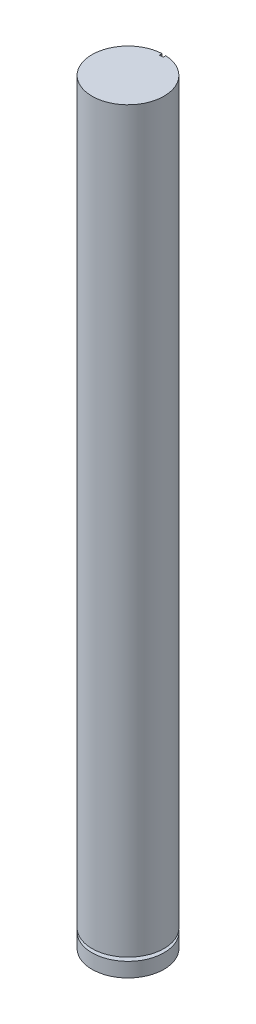
ISO-10303-21;
HEADER;
FILE_DESCRIPTION(('STEP AP214'),'2;1');
FILE_NAME('part.step','',(''),(''),'','','');
FILE_SCHEMA(('AUTOMOTIVE_DESIGN { 1 0 10303 214 1 1 1 1 }'));
ENDSEC;
DATA;
#1=APPLICATION_CONTEXT('core data for automotive mechanical design processes');
#2=APPLICATION_PROTOCOL_DEFINITION('international standard','automotive_design',2000,#1);
#3=PRODUCT_CONTEXT('',#1,'mechanical');
#4=PRODUCT('Part','Part','',(#3));
#5=PRODUCT_RELATED_PRODUCT_CATEGORY('part','',(#4));
#6=PRODUCT_DEFINITION_FORMATION('','',#4);
#7=PRODUCT_DEFINITION_CONTEXT('part definition',#1,'design');
#8=PRODUCT_DEFINITION('design','',#6,#7);
#9=PRODUCT_DEFINITION_SHAPE('','',#8);
#10=(LENGTH_UNIT() NAMED_UNIT(*) SI_UNIT(.MILLI.,.METRE.));
#11=(NAMED_UNIT(*) PLANE_ANGLE_UNIT() SI_UNIT($,.RADIAN.));
#12=(NAMED_UNIT(*) SI_UNIT($,.STERADIAN.) SOLID_ANGLE_UNIT());
#13=UNCERTAINTY_MEASURE_WITH_UNIT(LENGTH_MEASURE(1.E-05),#10,'distance_accuracy_value','');
#14=(GEOMETRIC_REPRESENTATION_CONTEXT(3) GLOBAL_UNCERTAINTY_ASSIGNED_CONTEXT((#13)) GLOBAL_UNIT_ASSIGNED_CONTEXT((#10,
#11,#12)) REPRESENTATION_CONTEXT('',''));
#15=CARTESIAN_POINT('',(0.,0.,0.));
#16=DIRECTION('',(0.,0.,1.));
#17=DIRECTION('',(1.,0.,0.));
#18=AXIS2_PLACEMENT_3D('',#15,#16,#17);
#19=CARTESIAN_POINT('',(0.,42.,0.));
#20=DIRECTION('',(0.,-1.,0.));
#21=DIRECTION('',(0.,0.,-1.));
#22=AXIS2_PLACEMENT_3D('',#19,#20,#21);
#23=CYLINDRICAL_SURFACE('',#22,2.);
#24=CARTESIAN_POINT('',(0.,0.,0.));
#25=DIRECTION('',(0.,1.,0.));
#26=DIRECTION('',(0.,0.,1.));
#27=AXIS2_PLACEMENT_3D('',#24,#25,#26);
#28=CIRCLE('',#27,2.);
#29=CARTESIAN_POINT('',(0.,0.,-2.));
#30=VERTEX_POINT('',#29);
#31=EDGE_CURVE('E110',#30,#30,#28,.T.);
#32=CARTESIAN_POINT('',(0.,0.8,0.));
#33=DIRECTION('',(0.,1.,0.));
#34=DIRECTION('',(0.,0.,1.));
#35=AXIS2_PLACEMENT_3D('',#32,#33,#34);
#36=CIRCLE('',#35,2.);
#37=CARTESIAN_POINT('',(0.,0.799999999999995,-2.));
#38=VERTEX_POINT('',#37);
#39=EDGE_CURVE('E107',#38,#38,#36,.T.);
#40=CARTESIAN_POINT('',(0.,0.,-2.));
#41=CARTESIAN_POINT('',(0.,0.0083333333333324,-2.));
#42=CARTESIAN_POINT('',(0.,0.0166666666666648,-2.));
#43=CARTESIAN_POINT('',(0.,0.033333333333332,-2.));
#44=CARTESIAN_POINT('',(0.,0.0416666666666667,-2.));
#45=CARTESIAN_POINT('',(0.,0.0583333333333338,-2.));
#46=CARTESIAN_POINT('',(0.,0.0666666666666663,-2.));
#47=CARTESIAN_POINT('',(0.,0.0833333333333334,-2.));
#48=CARTESIAN_POINT('',(0.,0.0916666666666681,-2.));
#49=CARTESIAN_POINT('',(0.,0.108333333333335,-2.));
#50=CARTESIAN_POINT('',(0.,0.116666666666668,-2.));
#51=CARTESIAN_POINT('',(0.,0.133333333333333,-2.));
#52=CARTESIAN_POINT('',(0.,0.141666666666665,-2.));
#53=CARTESIAN_POINT('',(0.,0.158333333333332,-2.));
#54=CARTESIAN_POINT('',(0.,0.166666666666667,-2.));
#55=CARTESIAN_POINT('',(0.,0.183333333333334,-2.));
#56=CARTESIAN_POINT('',(0.,0.191666666666666,-2.));
#57=CARTESIAN_POINT('',(0.,0.208333333333331,-2.));
#58=CARTESIAN_POINT('',(0.,0.216666666666664,-2.));
#59=CARTESIAN_POINT('',(0.,0.233333333333331,-2.));
#60=CARTESIAN_POINT('',(0.,0.241666666666666,-2.));
#61=CARTESIAN_POINT('',(0.,0.258333333333333,-2.));
#62=CARTESIAN_POINT('',(0.,0.266666666666665,-2.));
#63=CARTESIAN_POINT('',(0.,0.28333333333333,-2.));
#64=CARTESIAN_POINT('',(0.,0.291666666666662,-2.));
#65=CARTESIAN_POINT('',(0.,0.308333333333329,-2.));
#66=CARTESIAN_POINT('',(0.,0.316666666666664,-2.));
#67=CARTESIAN_POINT('',(0.,0.333333333333331,-2.));
#68=CARTESIAN_POINT('',(0.,0.341666666666664,-2.));
#69=CARTESIAN_POINT('',(0.,0.358333333333331,-2.));
#70=CARTESIAN_POINT('',(0.,0.366666666666666,-2.));
#71=CARTESIAN_POINT('',(0.,0.383333333333333,-2.));
#72=CARTESIAN_POINT('',(0.,0.391666666666665,-2.));
#73=CARTESIAN_POINT('',(0.,0.40833333333333,-2.));
#74=CARTESIAN_POINT('',(0.,0.416666666666662,-2.));
#75=CARTESIAN_POINT('',(0.,0.43333333333333,-2.));
#76=CARTESIAN_POINT('',(0.,0.441666666666664,-2.));
#77=CARTESIAN_POINT('',(0.,0.458333333333331,-2.));
#78=CARTESIAN_POINT('',(0.,0.466666666666664,-2.));
#79=CARTESIAN_POINT('',(0.,0.483333333333331,-2.));
#80=CARTESIAN_POINT('',(0.,0.491666666666666,-2.));
#81=CARTESIAN_POINT('',(0.,0.508333333333333,-2.));
#82=CARTESIAN_POINT('',(0.,0.516666666666665,-2.));
#83=CARTESIAN_POINT('',(0.,0.53333333333333,-2.));
#84=CARTESIAN_POINT('',(0.,0.541666666666663,-2.));
#85=CARTESIAN_POINT('',(0.,0.55833333333333,-2.));
#86=CARTESIAN_POINT('',(0.,0.566666666666664,-2.));
#87=CARTESIAN_POINT('',(0.,0.583333333333331,-2.));
#88=CARTESIAN_POINT('',(0.,0.591666666666664,-2.));
#89=CARTESIAN_POINT('',(0.,0.608333333333329,-2.));
#90=CARTESIAN_POINT('',(0.,0.616666666666661,-2.));
#91=CARTESIAN_POINT('',(0.,0.633333333333328,-2.));
#92=CARTESIAN_POINT('',(0.,0.641666666666663,-2.));
#93=CARTESIAN_POINT('',(0.,0.65833333333333,-2.));
#94=CARTESIAN_POINT('',(0.,0.666666666666663,-2.));
#95=CARTESIAN_POINT('',(0.,0.683333333333327,-2.));
#96=CARTESIAN_POINT('',(0.,0.69166666666666,-2.));
#97=CARTESIAN_POINT('',(0.,0.708333333333327,-2.));
#98=CARTESIAN_POINT('',(0.,0.716666666666662,-2.));
#99=CARTESIAN_POINT('',(0.,0.733333333333329,-2.));
#100=CARTESIAN_POINT('',(0.,0.741666666666661,-2.));
#101=CARTESIAN_POINT('',(0.,0.758333333333328,-2.));
#102=CARTESIAN_POINT('',(0.,0.766666666666663,-2.));
#103=CARTESIAN_POINT('',(0.,0.78333333333333,-2.));
#104=CARTESIAN_POINT('',(0.,0.791666666666663,-2.));
#105=CARTESIAN_POINT('',(0.,0.799999999999995,-2.));
#106=B_SPLINE_CURVE_WITH_KNOTS('',3,(#40,#41,#42,#43,#44,#45,#46,#47,#48,#49,#50,#51,#52,#53,
#54,#55,#56,#57,#58,#59,#60,#61,#62,#63,#64,#65,#66,#67,#68,#69,#70,#71,#72,#73,#74,#75,#76,#77,
#78,#79,#80,#81,#82,#83,#84,#85,#86,#87,#88,#89,#90,#91,#92,#93,#94,#95,#96,#97,#98,#99,#100,
#101,#102,#103,#104,#105),.UNSPECIFIED.,.F.,.F.,(4,2,2,2,2,2,2,2,2,2,2,2,2,2,2,2,2,2,2,2,2,2,2,
2,2,2,2,2,2,2,2,2,4),(0.,0.0249999999999972,0.0500000000000014,0.0749999999999987,
0.100000000000003,0.125,0.149999999999997,0.175000000000002,0.199999999999999,0.224999999999996,
0.25,0.274999999999997,0.299999999999995,0.324999999999999,0.349999999999996,0.375,
0.399999999999998,0.424999999999995,0.449999999999999,0.474999999999996,0.5,0.524999999999998,
0.549999999999995,0.574999999999999,0.599999999999996,0.624999999999994,0.649999999999998,
0.674999999999995,0.699999999999992,0.724999999999997,0.749999999999994,0.774999999999998,
0.799999999999995),.UNSPECIFIED.);
#107=EDGE_CURVE('BSEAM32',#30,#38,#106,.T.);
#108=ORIENTED_EDGE('',*,*,#31,.T.);
#109=ORIENTED_EDGE('',*,*,#39,.F.);
#110=ORIENTED_EDGE('',*,*,#107,.T.);
#111=ORIENTED_EDGE('',*,*,#107,.F.);
#112=EDGE_LOOP('',(#108,#110,#109,#111));
#113=FACE_BOUND('',#112,.T.);
#114=ADVANCED_FACE('F32',(#113),#23,.T.);
#115=CARTESIAN_POINT('',(0.,0.,0.));
#116=DIRECTION('',(0.,1.,0.));
#117=DIRECTION('',(0.,0.,1.));
#118=AXIS2_PLACEMENT_3D('',#115,#116,#117);
#119=PLANE('',#118);
#120=ORIENTED_EDGE('',*,*,#31,.F.);
#121=EDGE_LOOP('',(#120));
#122=FACE_BOUND('',#121,.T.);
#123=ADVANCED_FACE('F133',(#122),#119,.F.);
#124=CARTESIAN_POINT('',(0.,0.8,-2.));
#125=DIRECTION('',(0.,1.,0.));
#126=DIRECTION('',(0.,0.,1.));
#127=AXIS2_PLACEMENT_3D('',#124,#125,#126);
#128=PLANE('',#127);
#129=ORIENTED_EDGE('',*,*,#39,.T.);
#130=EDGE_LOOP('',(#129));
#131=FACE_BOUND('',#130,.T.);
#132=CARTESIAN_POINT('',(0.,0.8,0.));
#133=DIRECTION('',(0.,1.,0.));
#134=DIRECTION('',(0.,0.,1.));
#135=AXIS2_PLACEMENT_3D('',#132,#133,#134);
#136=CIRCLE('',#135,1.5);
#137=CARTESIAN_POINT('',(0.,0.8,1.5));
#138=VERTEX_POINT('',#137);
#139=EDGE_CURVE('E104',#138,#138,#136,.T.);
#140=ORIENTED_EDGE('',*,*,#139,.F.);
#141=EDGE_LOOP('',(#140));
#142=FACE_BOUND('',#141,.T.);
#143=ADVANCED_FACE('F138',(#131,#142),#128,.T.);
#144=CARTESIAN_POINT('',(0.,3.062104397666,0.));
#145=DIRECTION('',(0.,1.,0.));
#146=DIRECTION('',(0.,0.,1.));
#147=AXIS2_PLACEMENT_3D('',#144,#145,#146);
#148=CYLINDRICAL_SURFACE('',#147,1.5);
#149=ORIENTED_EDGE('',*,*,#139,.T.);
#150=EDGE_LOOP('',(#149));
#151=FACE_BOUND('',#150,.T.);
#152=CARTESIAN_POINT('',(0.,1.,0.));
#153=DIRECTION('',(0.,1.,0.));
#154=DIRECTION('',(0.,0.,1.));
#155=AXIS2_PLACEMENT_3D('',#152,#153,#154);
#156=CIRCLE('',#155,1.5);
#157=CARTESIAN_POINT('',(0.,1.,1.5));
#158=VERTEX_POINT('',#157);
#159=EDGE_CURVE('E101',#158,#158,#156,.T.);
#160=ORIENTED_EDGE('',*,*,#159,.F.);
#161=EDGE_LOOP('',(#160));
#162=FACE_BOUND('',#161,.T.);
#163=ADVANCED_FACE('F146',(#151,#162),#148,.T.);
#164=CARTESIAN_POINT('',(0.,1.,-2.));
#165=DIRECTION('',(0.,-1.,0.));
#166=DIRECTION('',(0.,0.,-1.));
#167=AXIS2_PLACEMENT_3D('',#164,#165,#166);
#168=PLANE('',#167);
#169=ORIENTED_EDGE('',*,*,#159,.T.);
#170=EDGE_LOOP('',(#169));
#171=FACE_BOUND('',#170,.T.);
#172=CARTESIAN_POINT('',(0.,1.,0.));
#173=DIRECTION('',(0.,1.,0.));
#174=DIRECTION('',(0.,0.,1.));
#175=AXIS2_PLACEMENT_3D('',#172,#173,#174);
#176=CIRCLE('',#175,2.);
#177=CARTESIAN_POINT('',(0.,1.,2.));
#178=VERTEX_POINT('',#177);
#179=EDGE_CURVE('E97',#178,#178,#176,.T.);
#180=ORIENTED_EDGE('',*,*,#179,.F.);
#181=EDGE_LOOP('',(#180));
#182=FACE_BOUND('',#181,.T.);
#183=ADVANCED_FACE('F152',(#171,#182),#168,.T.);
#184=CARTESIAN_POINT('',(0.,42.,0.));
#185=DIRECTION('',(0.,1.,0.));
#186=DIRECTION('',(0.,0.,1.));
#187=AXIS2_PLACEMENT_3D('',#184,#185,#186);
#188=PLANE('',#187);
#189=DIRECTION('',(0.,0.,-1.));
#190=VECTOR('',#189,1.);
#191=CARTESIAN_POINT('',(0.1,42.,-2.));
#192=LINE('',#191,#190);
#193=CARTESIAN_POINT('',(0.1,42.,-1.85));
#194=VERTEX_POINT('',#193);
#195=CARTESIAN_POINT('',(0.1,42.,-1.99749843554382));
#196=VERTEX_POINT('',#195);
#197=EDGE_CURVE('E92',#194,#196,#192,.T.);
#198=ORIENTED_EDGE('',*,*,#197,.F.);
#199=DIRECTION('',(1.,0.,0.));
#200=VECTOR('',#199,1.);
#201=CARTESIAN_POINT('',(0.1,42.,-1.85));
#202=LINE('',#201,#200);
#203=CARTESIAN_POINT('',(-0.1,42.,-1.85));
#204=VERTEX_POINT('',#203);
#205=EDGE_CURVE('E95',#204,#194,#202,.T.);
#206=ORIENTED_EDGE('',*,*,#205,.F.);
#207=DIRECTION('',(0.,0.,1.));
#208=VECTOR('',#207,1.);
#209=CARTESIAN_POINT('',(-0.1,42.,-2.));
#210=LINE('',#209,#208);
#211=CARTESIAN_POINT('',(-0.1,42.,-1.99749843554382));
#212=VERTEX_POINT('',#211);
#213=EDGE_CURVE('E81',#212,#204,#210,.T.);
#214=ORIENTED_EDGE('',*,*,#213,.F.);
#215=CARTESIAN_POINT('',(0.,42.,0.));
#216=DIRECTION('',(0.,1.,0.));
#217=DIRECTION('',(0.,0.,1.));
#218=AXIS2_PLACEMENT_3D('',#215,#216,#217);
#219=CIRCLE('',#218,2.);
#220=EDGE_CURVE('E111',#212,#196,#219,.T.);
#221=ORIENTED_EDGE('',*,*,#220,.T.);
#222=EDGE_LOOP('',(#198,#206,#214,#221));
#223=FACE_BOUND('',#222,.T.);
#224=ADVANCED_FACE('F121',(#223),#188,.T.);
#225=CARTESIAN_POINT('',(0.,39.,0.));
#226=DIRECTION('',(0.,-1.,0.));
#227=DIRECTION('',(0.,0.,-1.));
#228=AXIS2_PLACEMENT_3D('',#225,#226,#227);
#229=CIRCLE('',#228,2.);
#230=CARTESIAN_POINT('',(-0.1,39.,-1.99749843554382));
#231=VERTEX_POINT('',#230);
#232=CARTESIAN_POINT('',(0.1,39.,-1.99749843554382));
#233=VERTEX_POINT('',#232);
#234=EDGE_CURVE('E46',#231,#233,#229,.T.);
#235=ORIENTED_EDGE('',*,*,#234,.T.);
#236=DIRECTION('',(0.,-1.,0.));
#237=VECTOR('',#236,1.);
#238=CARTESIAN_POINT('',(0.1,42.,-1.99749843554382));
#239=LINE('',#238,#237);
#240=EDGE_CURVE('E11',#233,#196,#239,.F.);
#241=ORIENTED_EDGE('',*,*,#240,.T.);
#242=ORIENTED_EDGE('',*,*,#220,.F.);
#243=DIRECTION('',(0.,-1.,0.));
#244=VECTOR('',#243,1.);
#245=CARTESIAN_POINT('',(-0.1,42.,-1.99749843554382));
#246=LINE('',#245,#244);
#247=EDGE_CURVE('E39',#212,#231,#246,.T.);
#248=ORIENTED_EDGE('',*,*,#247,.T.);
#249=EDGE_LOOP('',(#235,#241,#242,#248));
#250=FACE_BOUND('',#249,.T.);
#251=ORIENTED_EDGE('',*,*,#179,.T.);
#252=EDGE_LOOP('',(#251));
#253=FACE_BOUND('',#252,.T.);
#254=ADVANCED_FACE('F117',(#250,#253),#23,.T.);
#255=CARTESIAN_POINT('',(0.1,39.,-2.));
#256=DIRECTION('',(1.,0.,0.));
#257=DIRECTION('',(0.,0.,-1.));
#258=AXIS2_PLACEMENT_3D('',#255,#256,#257);
#259=PLANE('',#258);
#260=DIRECTION('',(0.,0.,-1.));
#261=VECTOR('',#260,1.);
#262=CARTESIAN_POINT('',(0.1,39.,-2.));
#263=LINE('',#262,#261);
#264=CARTESIAN_POINT('',(0.1,39.,-1.85));
#265=VERTEX_POINT('',#264);
#266=EDGE_CURVE('E75',#265,#233,#263,.T.);
#267=ORIENTED_EDGE('',*,*,#266,.F.);
#268=DIRECTION('',(0.,1.,0.));
#269=VECTOR('',#268,1.);
#270=CARTESIAN_POINT('',(0.1,39.,-1.85));
#271=LINE('',#270,#269);
#272=EDGE_CURVE('E85',#265,#194,#271,.T.);
#273=ORIENTED_EDGE('',*,*,#272,.T.);
#274=ORIENTED_EDGE('',*,*,#197,.T.);
#275=ORIENTED_EDGE('',*,*,#240,.F.);
#276=EDGE_LOOP('',(#267,#273,#274,#275));
#277=FACE_BOUND('',#276,.T.);
#278=ADVANCED_FACE('F123',(#277),#259,.F.);
#279=CARTESIAN_POINT('',(-0.1,39.,-2.));
#280=DIRECTION('',(-1.,0.,0.));
#281=DIRECTION('',(0.,0.,1.));
#282=AXIS2_PLACEMENT_3D('',#279,#280,#281);
#283=PLANE('',#282);
#284=ORIENTED_EDGE('',*,*,#213,.T.);
#285=DIRECTION('',(0.,1.,0.));
#286=VECTOR('',#285,1.);
#287=CARTESIAN_POINT('',(-0.1,39.,-1.85));
#288=LINE('',#287,#286);
#289=CARTESIAN_POINT('',(-0.1,39.,-1.85));
#290=VERTEX_POINT('',#289);
#291=EDGE_CURVE('E78',#290,#204,#288,.T.);
#292=ORIENTED_EDGE('',*,*,#291,.F.);
#293=DIRECTION('',(0.,0.,1.));
#294=VECTOR('',#293,1.);
#295=CARTESIAN_POINT('',(-0.1,39.,-2.));
#296=LINE('',#295,#294);
#297=EDGE_CURVE('E69',#231,#290,#296,.T.);
#298=ORIENTED_EDGE('',*,*,#297,.F.);
#299=ORIENTED_EDGE('',*,*,#247,.F.);
#300=EDGE_LOOP('',(#284,#292,#298,#299));
#301=FACE_BOUND('',#300,.T.);
#302=ADVANCED_FACE('F79',(#301),#283,.F.);
#303=CARTESIAN_POINT('',(0.,39.,0.));
#304=DIRECTION('',(0.,-1.,0.));
#305=DIRECTION('',(0.,0.,-1.));
#306=AXIS2_PLACEMENT_3D('',#303,#304,#305);
#307=PLANE('',#306);
#308=ORIENTED_EDGE('',*,*,#234,.F.);
#309=ORIENTED_EDGE('',*,*,#297,.T.);
#310=DIRECTION('',(1.,0.,0.));
#311=VECTOR('',#310,1.);
#312=CARTESIAN_POINT('',(0.1,39.,-1.85));
#313=LINE('',#312,#311);
#314=EDGE_CURVE('E73',#290,#265,#313,.T.);
#315=ORIENTED_EDGE('',*,*,#314,.T.);
#316=ORIENTED_EDGE('',*,*,#266,.T.);
#317=EDGE_LOOP('',(#308,#309,#315,#316));
#318=FACE_BOUND('',#317,.T.);
#319=ADVANCED_FACE('F71',(#318),#307,.F.);
#320=CARTESIAN_POINT('',(0.1,39.,-1.85));
#321=DIRECTION('',(0.,0.,1.));
#322=DIRECTION('',(1.,0.,0.));
#323=AXIS2_PLACEMENT_3D('',#320,#321,#322);
#324=PLANE('',#323);
#325=ORIENTED_EDGE('',*,*,#205,.T.);
#326=ORIENTED_EDGE('',*,*,#272,.F.);
#327=ORIENTED_EDGE('',*,*,#314,.F.);
#328=ORIENTED_EDGE('',*,*,#291,.T.);
#329=EDGE_LOOP('',(#325,#326,#327,#328));
#330=FACE_BOUND('',#329,.T.);
#331=ADVANCED_FACE('F87',(#330),#324,.F.);
#332=CLOSED_SHELL('',(#114,#123,#143,#163,#183,#224,#254,#278,#302,#319,#331));
#333=MANIFOLD_SOLID_BREP('B2',#332);
#334=ADVANCED_BREP_SHAPE_REPRESENTATION('',(#18,#333),#14);
#335=SHAPE_DEFINITION_REPRESENTATION(#9,#334);
ENDSEC;
END-ISO-10303-21;
